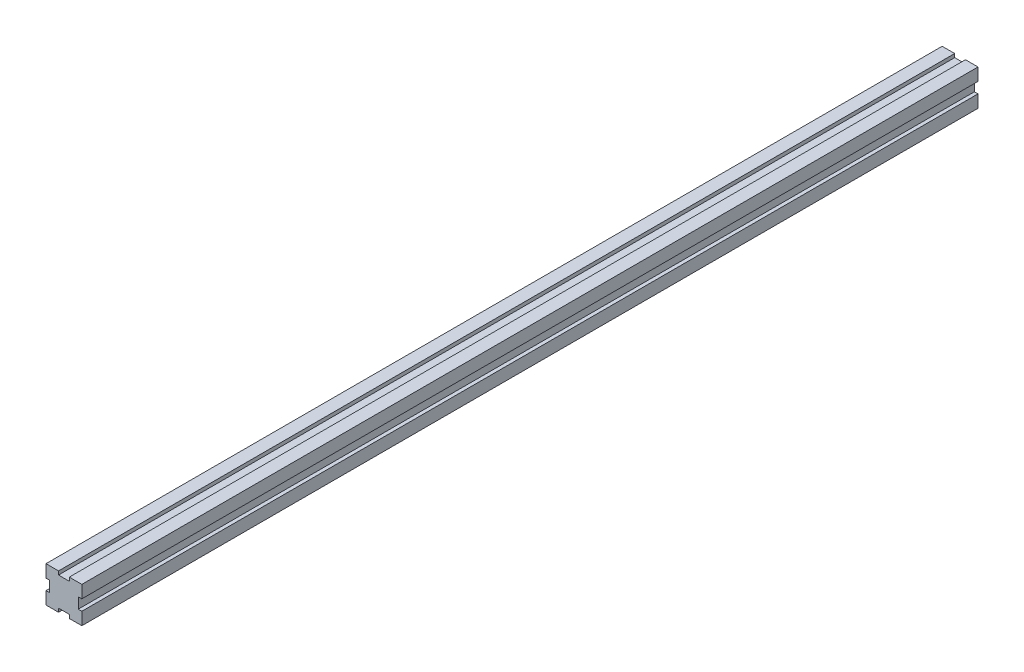
ISO-10303-21;
HEADER;
FILE_DESCRIPTION(('STEP AP214'),'2;1');
FILE_NAME('part.step','',(''),(''),'','','');
FILE_SCHEMA(('AUTOMOTIVE_DESIGN { 1 0 10303 214 1 1 1 1 }'));
ENDSEC;
DATA;
#1=APPLICATION_CONTEXT('core data for automotive mechanical design processes');
#2=APPLICATION_PROTOCOL_DEFINITION('international standard','automotive_design',2000,#1);
#3=PRODUCT_CONTEXT('',#1,'mechanical');
#4=PRODUCT('Part','Part','',(#3));
#5=PRODUCT_RELATED_PRODUCT_CATEGORY('part','',(#4));
#6=PRODUCT_DEFINITION_FORMATION('','',#4);
#7=PRODUCT_DEFINITION_CONTEXT('part definition',#1,'design');
#8=PRODUCT_DEFINITION('design','',#6,#7);
#9=PRODUCT_DEFINITION_SHAPE('','',#8);
#10=(LENGTH_UNIT() NAMED_UNIT(*) SI_UNIT(.MILLI.,.METRE.));
#11=(NAMED_UNIT(*) PLANE_ANGLE_UNIT() SI_UNIT($,.RADIAN.));
#12=(NAMED_UNIT(*) SI_UNIT($,.STERADIAN.) SOLID_ANGLE_UNIT());
#13=UNCERTAINTY_MEASURE_WITH_UNIT(LENGTH_MEASURE(1.E-05),#10,'distance_accuracy_value','');
#14=(GEOMETRIC_REPRESENTATION_CONTEXT(3) GLOBAL_UNCERTAINTY_ASSIGNED_CONTEXT((#13)) GLOBAL_UNIT_ASSIGNED_CONTEXT((#10,
#11,#12)) REPRESENTATION_CONTEXT('',''));
#15=CARTESIAN_POINT('',(0.,0.,0.));
#16=DIRECTION('',(0.,0.,1.));
#17=DIRECTION('',(1.,0.,0.));
#18=AXIS2_PLACEMENT_3D('',#15,#16,#17);
#19=CARTESIAN_POINT('',(0.,0.,500.));
#20=DIRECTION('',(1.,0.,0.));
#21=DIRECTION('',(0.,1.,0.));
#22=AXIS2_PLACEMENT_3D('',#19,#20,#21);
#23=PLANE('',#22);
#24=DIRECTION('',(0.,-1.,0.));
#25=VECTOR('',#24,1.);
#26=CARTESIAN_POINT('',(0.,0.,0.));
#27=LINE('',#26,#25);
#28=CARTESIAN_POINT('',(0.,0.,0.));
#29=VERTEX_POINT('',#28);
#30=CARTESIAN_POINT('',(0.,-7.,0.));
#31=VERTEX_POINT('',#30);
#32=EDGE_CURVE('E203',#29,#31,#27,.T.);
#33=ORIENTED_EDGE('',*,*,#32,.T.);
#34=DIRECTION('',(0.,0.,-1.));
#35=VECTOR('',#34,1.);
#36=CARTESIAN_POINT('',(0.,-7.,500.));
#37=LINE('',#36,#35);
#38=CARTESIAN_POINT('',(0.,-7.,500.));
#39=VERTEX_POINT('',#38);
#40=EDGE_CURVE('E11',#39,#31,#37,.T.);
#41=ORIENTED_EDGE('',*,*,#40,.F.);
#42=DIRECTION('',(0.,-1.,0.));
#43=VECTOR('',#42,1.);
#44=CARTESIAN_POINT('',(0.,0.,500.));
#45=LINE('',#44,#43);
#46=CARTESIAN_POINT('',(0.,0.,500.));
#47=VERTEX_POINT('',#46);
#48=EDGE_CURVE('E241',#47,#39,#45,.T.);
#49=ORIENTED_EDGE('',*,*,#48,.F.);
#50=DIRECTION('',(0.,0.,-1.));
#51=VECTOR('',#50,1.);
#52=CARTESIAN_POINT('',(0.,0.,500.));
#53=LINE('',#52,#51);
#54=EDGE_CURVE('E199',#47,#29,#53,.T.);
#55=ORIENTED_EDGE('',*,*,#54,.T.);
#56=EDGE_LOOP('',(#33,#41,#49,#55));
#57=FACE_BOUND('',#56,.T.);
#58=ADVANCED_FACE('F35',(#57),#23,.F.);
#59=CARTESIAN_POINT('',(0.,-7.,500.));
#60=DIRECTION('',(0.,1.,0.));
#61=DIRECTION('',(-1.,0.,0.));
#62=AXIS2_PLACEMENT_3D('',#59,#60,#61);
#63=PLANE('',#62);
#64=DIRECTION('',(1.,0.,0.));
#65=VECTOR('',#64,1.);
#66=CARTESIAN_POINT('',(0.,-7.,0.));
#67=LINE('',#66,#65);
#68=CARTESIAN_POINT('',(2.,-7.,0.));
#69=VERTEX_POINT('',#68);
#70=EDGE_CURVE('E206',#31,#69,#67,.T.);
#71=ORIENTED_EDGE('',*,*,#70,.T.);
#72=DIRECTION('',(0.,0.,-1.));
#73=VECTOR('',#72,1.);
#74=CARTESIAN_POINT('',(2.,-7.,500.));
#75=LINE('',#74,#73);
#76=CARTESIAN_POINT('',(2.,-7.,500.));
#77=VERTEX_POINT('',#76);
#78=EDGE_CURVE('E43',#77,#69,#75,.T.);
#79=ORIENTED_EDGE('',*,*,#78,.F.);
#80=DIRECTION('',(1.,0.,0.));
#81=VECTOR('',#80,1.);
#82=CARTESIAN_POINT('',(0.,-7.,500.));
#83=LINE('',#82,#81);
#84=EDGE_CURVE('E130',#39,#77,#83,.T.);
#85=ORIENTED_EDGE('',*,*,#84,.F.);
#86=ORIENTED_EDGE('',*,*,#40,.T.);
#87=EDGE_LOOP('',(#71,#79,#85,#86));
#88=FACE_BOUND('',#87,.T.);
#89=ADVANCED_FACE('F359',(#88),#63,.F.);
#90=CARTESIAN_POINT('',(2.,-7.,500.));
#91=DIRECTION('',(1.,0.,0.));
#92=DIRECTION('',(0.,0.,-1.));
#93=AXIS2_PLACEMENT_3D('',#90,#91,#92);
#94=PLANE('',#93);
#95=DIRECTION('',(0.,-1.,0.));
#96=VECTOR('',#95,1.);
#97=CARTESIAN_POINT('',(2.,-7.,0.));
#98=LINE('',#97,#96);
#99=CARTESIAN_POINT('',(2.,-13.,0.));
#100=VERTEX_POINT('',#99);
#101=EDGE_CURVE('E208',#69,#100,#98,.T.);
#102=ORIENTED_EDGE('',*,*,#101,.T.);
#103=DIRECTION('',(0.,0.,-1.));
#104=VECTOR('',#103,1.);
#105=CARTESIAN_POINT('',(2.,-13.,500.));
#106=LINE('',#105,#104);
#107=CARTESIAN_POINT('',(2.,-13.,500.));
#108=VERTEX_POINT('',#107);
#109=EDGE_CURVE('E284',#108,#100,#106,.T.);
#110=ORIENTED_EDGE('',*,*,#109,.F.);
#111=DIRECTION('',(0.,-1.,0.));
#112=VECTOR('',#111,1.);
#113=CARTESIAN_POINT('',(2.,-7.,500.));
#114=LINE('',#113,#112);
#115=EDGE_CURVE('E292',#77,#108,#114,.T.);
#116=ORIENTED_EDGE('',*,*,#115,.F.);
#117=ORIENTED_EDGE('',*,*,#78,.T.);
#118=EDGE_LOOP('',(#102,#110,#116,#117));
#119=FACE_BOUND('',#118,.T.);
#120=ADVANCED_FACE('F290',(#119),#94,.F.);
#121=CARTESIAN_POINT('',(0.,-13.,500.));
#122=DIRECTION('',(0.,-1.,0.));
#123=DIRECTION('',(1.,0.,0.));
#124=AXIS2_PLACEMENT_3D('',#121,#122,#123);
#125=PLANE('',#124);
#126=DIRECTION('',(-1.,0.,0.));
#127=VECTOR('',#126,1.);
#128=CARTESIAN_POINT('',(0.,-13.,0.));
#129=LINE('',#128,#127);
#130=CARTESIAN_POINT('',(0.,-13.,0.));
#131=VERTEX_POINT('',#130);
#132=EDGE_CURVE('E210',#100,#131,#129,.T.);
#133=ORIENTED_EDGE('',*,*,#132,.T.);
#134=DIRECTION('',(0.,0.,-1.));
#135=VECTOR('',#134,1.);
#136=CARTESIAN_POINT('',(0.,-13.,500.));
#137=LINE('',#136,#135);
#138=CARTESIAN_POINT('',(0.,-13.,500.));
#139=VERTEX_POINT('',#138);
#140=EDGE_CURVE('E281',#139,#131,#137,.T.);
#141=ORIENTED_EDGE('',*,*,#140,.F.);
#142=DIRECTION('',(-1.,0.,0.));
#143=VECTOR('',#142,1.);
#144=CARTESIAN_POINT('',(0.,-13.,500.));
#145=LINE('',#144,#143);
#146=EDGE_CURVE('E310',#108,#139,#145,.T.);
#147=ORIENTED_EDGE('',*,*,#146,.F.);
#148=ORIENTED_EDGE('',*,*,#109,.T.);
#149=EDGE_LOOP('',(#133,#141,#147,#148));
#150=FACE_BOUND('',#149,.T.);
#151=ADVANCED_FACE('F301',(#150),#125,.F.);
#152=CARTESIAN_POINT('',(0.,-13.,500.));
#153=DIRECTION('',(1.,0.,0.));
#154=DIRECTION('',(0.,1.,0.));
#155=AXIS2_PLACEMENT_3D('',#152,#153,#154);
#156=PLANE('',#155);
#157=DIRECTION('',(0.,-1.,0.));
#158=VECTOR('',#157,1.);
#159=CARTESIAN_POINT('',(0.,-13.,0.));
#160=LINE('',#159,#158);
#161=CARTESIAN_POINT('',(0.,-20.,0.));
#162=VERTEX_POINT('',#161);
#163=EDGE_CURVE('E212',#131,#162,#160,.T.);
#164=ORIENTED_EDGE('',*,*,#163,.T.);
#165=DIRECTION('',(0.,0.,-1.));
#166=VECTOR('',#165,1.);
#167=CARTESIAN_POINT('',(0.,-20.,500.));
#168=LINE('',#167,#166);
#169=CARTESIAN_POINT('',(0.,-20.,500.));
#170=VERTEX_POINT('',#169);
#171=EDGE_CURVE('E278',#170,#162,#168,.T.);
#172=ORIENTED_EDGE('',*,*,#171,.F.);
#173=DIRECTION('',(0.,-1.,0.));
#174=VECTOR('',#173,1.);
#175=CARTESIAN_POINT('',(0.,-13.,500.));
#176=LINE('',#175,#174);
#177=EDGE_CURVE('E307',#139,#170,#176,.T.);
#178=ORIENTED_EDGE('',*,*,#177,.F.);
#179=ORIENTED_EDGE('',*,*,#140,.T.);
#180=EDGE_LOOP('',(#164,#172,#178,#179));
#181=FACE_BOUND('',#180,.T.);
#182=ADVANCED_FACE('F305',(#181),#156,.F.);
#183=CARTESIAN_POINT('',(0.,-20.,500.));
#184=DIRECTION('',(0.,1.,0.));
#185=DIRECTION('',(0.,0.,1.));
#186=AXIS2_PLACEMENT_3D('',#183,#184,#185);
#187=PLANE('',#186);
#188=DIRECTION('',(1.,0.,0.));
#189=VECTOR('',#188,1.);
#190=CARTESIAN_POINT('',(0.,-20.,0.));
#191=LINE('',#190,#189);
#192=CARTESIAN_POINT('',(7.,-20.,0.));
#193=VERTEX_POINT('',#192);
#194=EDGE_CURVE('E214',#162,#193,#191,.T.);
#195=ORIENTED_EDGE('',*,*,#194,.T.);
#196=DIRECTION('',(0.,0.,-1.));
#197=VECTOR('',#196,1.);
#198=CARTESIAN_POINT('',(7.,-20.,500.));
#199=LINE('',#198,#197);
#200=CARTESIAN_POINT('',(7.,-20.,500.));
#201=VERTEX_POINT('',#200);
#202=EDGE_CURVE('E275',#201,#193,#199,.T.);
#203=ORIENTED_EDGE('',*,*,#202,.F.);
#204=DIRECTION('',(1.,0.,0.));
#205=VECTOR('',#204,1.);
#206=CARTESIAN_POINT('',(0.,-20.,500.));
#207=LINE('',#206,#205);
#208=EDGE_CURVE('E309',#170,#201,#207,.T.);
#209=ORIENTED_EDGE('',*,*,#208,.F.);
#210=ORIENTED_EDGE('',*,*,#171,.T.);
#211=EDGE_LOOP('',(#195,#203,#209,#210));
#212=FACE_BOUND('',#211,.T.);
#213=ADVANCED_FACE('F372',(#212),#187,.F.);
#214=CARTESIAN_POINT('',(7.,-20.,500.));
#215=DIRECTION('',(-1.,0.,0.));
#216=DIRECTION('',(0.,-1.,0.));
#217=AXIS2_PLACEMENT_3D('',#214,#215,#216);
#218=PLANE('',#217);
#219=DIRECTION('',(0.,1.,0.));
#220=VECTOR('',#219,1.);
#221=CARTESIAN_POINT('',(7.,-20.,0.));
#222=LINE('',#221,#220);
#223=CARTESIAN_POINT('',(7.,-18.,0.));
#224=VERTEX_POINT('',#223);
#225=EDGE_CURVE('E216',#193,#224,#222,.T.);
#226=ORIENTED_EDGE('',*,*,#225,.T.);
#227=DIRECTION('',(0.,0.,-1.));
#228=VECTOR('',#227,1.);
#229=CARTESIAN_POINT('',(7.,-18.,500.));
#230=LINE('',#229,#228);
#231=CARTESIAN_POINT('',(7.,-18.,500.));
#232=VERTEX_POINT('',#231);
#233=EDGE_CURVE('E272',#232,#224,#230,.T.);
#234=ORIENTED_EDGE('',*,*,#233,.F.);
#235=DIRECTION('',(0.,1.,0.));
#236=VECTOR('',#235,1.);
#237=CARTESIAN_POINT('',(7.,-20.,500.));
#238=LINE('',#237,#236);
#239=EDGE_CURVE('E312',#201,#232,#238,.T.);
#240=ORIENTED_EDGE('',*,*,#239,.F.);
#241=ORIENTED_EDGE('',*,*,#202,.T.);
#242=EDGE_LOOP('',(#226,#234,#240,#241));
#243=FACE_BOUND('',#242,.T.);
#244=ADVANCED_FACE('F375',(#243),#218,.F.);
#245=CARTESIAN_POINT('',(7.,-18.,500.));
#246=DIRECTION('',(0.,1.,0.));
#247=DIRECTION('',(0.,0.,1.));
#248=AXIS2_PLACEMENT_3D('',#245,#246,#247);
#249=PLANE('',#248);
#250=DIRECTION('',(1.,0.,0.));
#251=VECTOR('',#250,1.);
#252=CARTESIAN_POINT('',(7.,-18.,0.));
#253=LINE('',#252,#251);
#254=CARTESIAN_POINT('',(13.,-18.,0.));
#255=VERTEX_POINT('',#254);
#256=EDGE_CURVE('E218',#224,#255,#253,.T.);
#257=ORIENTED_EDGE('',*,*,#256,.T.);
#258=DIRECTION('',(0.,0.,-1.));
#259=VECTOR('',#258,1.);
#260=CARTESIAN_POINT('',(13.,-18.,500.));
#261=LINE('',#260,#259);
#262=CARTESIAN_POINT('',(13.,-18.,500.));
#263=VERTEX_POINT('',#262);
#264=EDGE_CURVE('E269',#263,#255,#261,.T.);
#265=ORIENTED_EDGE('',*,*,#264,.F.);
#266=DIRECTION('',(1.,0.,0.));
#267=VECTOR('',#266,1.);
#268=CARTESIAN_POINT('',(7.,-18.,500.));
#269=LINE('',#268,#267);
#270=EDGE_CURVE('E318',#232,#263,#269,.T.);
#271=ORIENTED_EDGE('',*,*,#270,.F.);
#272=ORIENTED_EDGE('',*,*,#233,.T.);
#273=EDGE_LOOP('',(#257,#265,#271,#272));
#274=FACE_BOUND('',#273,.T.);
#275=ADVANCED_FACE('F379',(#274),#249,.F.);
#276=CARTESIAN_POINT('',(13.,-20.,500.));
#277=DIRECTION('',(1.,0.,0.));
#278=DIRECTION('',(0.,1.,0.));
#279=AXIS2_PLACEMENT_3D('',#276,#277,#278);
#280=PLANE('',#279);
#281=DIRECTION('',(0.,-1.,0.));
#282=VECTOR('',#281,1.);
#283=CARTESIAN_POINT('',(13.,-20.,0.));
#284=LINE('',#283,#282);
#285=CARTESIAN_POINT('',(13.,-20.,0.));
#286=VERTEX_POINT('',#285);
#287=EDGE_CURVE('E220',#255,#286,#284,.T.);
#288=ORIENTED_EDGE('',*,*,#287,.T.);
#289=DIRECTION('',(0.,0.,-1.));
#290=VECTOR('',#289,1.);
#291=CARTESIAN_POINT('',(13.,-20.,500.));
#292=LINE('',#291,#290);
#293=CARTESIAN_POINT('',(13.,-20.,500.));
#294=VERTEX_POINT('',#293);
#295=EDGE_CURVE('E266',#294,#286,#292,.T.);
#296=ORIENTED_EDGE('',*,*,#295,.F.);
#297=DIRECTION('',(0.,-1.,0.));
#298=VECTOR('',#297,1.);
#299=CARTESIAN_POINT('',(13.,-20.,500.));
#300=LINE('',#299,#298);
#301=EDGE_CURVE('E320',#263,#294,#300,.T.);
#302=ORIENTED_EDGE('',*,*,#301,.F.);
#303=ORIENTED_EDGE('',*,*,#264,.T.);
#304=EDGE_LOOP('',(#288,#296,#302,#303));
#305=FACE_BOUND('',#304,.T.);
#306=ADVANCED_FACE('F383',(#305),#280,.F.);
#307=CARTESIAN_POINT('',(13.,-20.,500.));
#308=DIRECTION('',(0.,1.,0.));
#309=DIRECTION('',(0.,0.,1.));
#310=AXIS2_PLACEMENT_3D('',#307,#308,#309);
#311=PLANE('',#310);
#312=DIRECTION('',(1.,0.,0.));
#313=VECTOR('',#312,1.);
#314=CARTESIAN_POINT('',(13.,-20.,0.));
#315=LINE('',#314,#313);
#316=CARTESIAN_POINT('',(20.,-20.,0.));
#317=VERTEX_POINT('',#316);
#318=EDGE_CURVE('E222',#286,#317,#315,.T.);
#319=ORIENTED_EDGE('',*,*,#318,.T.);
#320=DIRECTION('',(0.,0.,-1.));
#321=VECTOR('',#320,1.);
#322=CARTESIAN_POINT('',(20.,-20.,500.));
#323=LINE('',#322,#321);
#324=CARTESIAN_POINT('',(20.,-20.,500.));
#325=VERTEX_POINT('',#324);
#326=EDGE_CURVE('E263',#325,#317,#323,.T.);
#327=ORIENTED_EDGE('',*,*,#326,.F.);
#328=DIRECTION('',(1.,0.,0.));
#329=VECTOR('',#328,1.);
#330=CARTESIAN_POINT('',(13.,-20.,500.));
#331=LINE('',#330,#329);
#332=EDGE_CURVE('E322',#294,#325,#331,.T.);
#333=ORIENTED_EDGE('',*,*,#332,.F.);
#334=ORIENTED_EDGE('',*,*,#295,.T.);
#335=EDGE_LOOP('',(#319,#327,#333,#334));
#336=FACE_BOUND('',#335,.T.);
#337=ADVANCED_FACE('F387',(#336),#311,.F.);
#338=CARTESIAN_POINT('',(20.,-13.,500.));
#339=DIRECTION('',(-1.,0.,0.));
#340=DIRECTION('',(0.,0.,1.));
#341=AXIS2_PLACEMENT_3D('',#338,#339,#340);
#342=PLANE('',#341);
#343=DIRECTION('',(0.,1.,0.));
#344=VECTOR('',#343,1.);
#345=CARTESIAN_POINT('',(20.,-13.,0.));
#346=LINE('',#345,#344);
#347=CARTESIAN_POINT('',(20.,-13.,0.));
#348=VERTEX_POINT('',#347);
#349=EDGE_CURVE('E224',#317,#348,#346,.T.);
#350=ORIENTED_EDGE('',*,*,#349,.T.);
#351=DIRECTION('',(0.,0.,-1.));
#352=VECTOR('',#351,1.);
#353=CARTESIAN_POINT('',(20.,-13.,500.));
#354=LINE('',#353,#352);
#355=CARTESIAN_POINT('',(20.,-13.,500.));
#356=VERTEX_POINT('',#355);
#357=EDGE_CURVE('E260',#356,#348,#354,.T.);
#358=ORIENTED_EDGE('',*,*,#357,.F.);
#359=DIRECTION('',(0.,1.,0.));
#360=VECTOR('',#359,1.);
#361=CARTESIAN_POINT('',(20.,-13.,500.));
#362=LINE('',#361,#360);
#363=EDGE_CURVE('E324',#325,#356,#362,.T.);
#364=ORIENTED_EDGE('',*,*,#363,.F.);
#365=ORIENTED_EDGE('',*,*,#326,.T.);
#366=EDGE_LOOP('',(#350,#358,#364,#365));
#367=FACE_BOUND('',#366,.T.);
#368=ADVANCED_FACE('F391',(#367),#342,.F.);
#369=CARTESIAN_POINT('',(20.,-13.,500.));
#370=DIRECTION('',(0.,-1.,0.));
#371=DIRECTION('',(1.,0.,0.));
#372=AXIS2_PLACEMENT_3D('',#369,#370,#371);
#373=PLANE('',#372);
#374=DIRECTION('',(-1.,0.,0.));
#375=VECTOR('',#374,1.);
#376=CARTESIAN_POINT('',(20.,-13.,0.));
#377=LINE('',#376,#375);
#378=CARTESIAN_POINT('',(18.,-13.,0.));
#379=VERTEX_POINT('',#378);
#380=EDGE_CURVE('E226',#348,#379,#377,.T.);
#381=ORIENTED_EDGE('',*,*,#380,.T.);
#382=DIRECTION('',(0.,0.,-1.));
#383=VECTOR('',#382,1.);
#384=CARTESIAN_POINT('',(18.,-13.,500.));
#385=LINE('',#384,#383);
#386=CARTESIAN_POINT('',(18.,-13.,500.));
#387=VERTEX_POINT('',#386);
#388=EDGE_CURVE('E257',#387,#379,#385,.T.);
#389=ORIENTED_EDGE('',*,*,#388,.F.);
#390=DIRECTION('',(-1.,0.,0.));
#391=VECTOR('',#390,1.);
#392=CARTESIAN_POINT('',(20.,-13.,500.));
#393=LINE('',#392,#391);
#394=EDGE_CURVE('E326',#356,#387,#393,.T.);
#395=ORIENTED_EDGE('',*,*,#394,.F.);
#396=ORIENTED_EDGE('',*,*,#357,.T.);
#397=EDGE_LOOP('',(#381,#389,#395,#396));
#398=FACE_BOUND('',#397,.T.);
#399=ADVANCED_FACE('F395',(#398),#373,.F.);
#400=CARTESIAN_POINT('',(18.,-7.,500.));
#401=DIRECTION('',(-1.,0.,0.));
#402=DIRECTION('',(0.,0.,1.));
#403=AXIS2_PLACEMENT_3D('',#400,#401,#402);
#404=PLANE('',#403);
#405=DIRECTION('',(0.,1.,0.));
#406=VECTOR('',#405,1.);
#407=CARTESIAN_POINT('',(18.,-7.,0.));
#408=LINE('',#407,#406);
#409=CARTESIAN_POINT('',(18.,-7.,0.));
#410=VERTEX_POINT('',#409);
#411=EDGE_CURVE('E228',#379,#410,#408,.T.);
#412=ORIENTED_EDGE('',*,*,#411,.T.);
#413=DIRECTION('',(0.,0.,-1.));
#414=VECTOR('',#413,1.);
#415=CARTESIAN_POINT('',(18.,-7.,500.));
#416=LINE('',#415,#414);
#417=CARTESIAN_POINT('',(18.,-7.,500.));
#418=VERTEX_POINT('',#417);
#419=EDGE_CURVE('E254',#418,#410,#416,.T.);
#420=ORIENTED_EDGE('',*,*,#419,.F.);
#421=DIRECTION('',(0.,1.,0.));
#422=VECTOR('',#421,1.);
#423=CARTESIAN_POINT('',(18.,-7.,500.));
#424=LINE('',#423,#422);
#425=EDGE_CURVE('E328',#387,#418,#424,.T.);
#426=ORIENTED_EDGE('',*,*,#425,.F.);
#427=ORIENTED_EDGE('',*,*,#388,.T.);
#428=EDGE_LOOP('',(#412,#420,#426,#427));
#429=FACE_BOUND('',#428,.T.);
#430=ADVANCED_FACE('F399',(#429),#404,.F.);
#431=CARTESIAN_POINT('',(20.,-7.,500.));
#432=DIRECTION('',(0.,1.,0.));
#433=DIRECTION('',(-1.,0.,0.));
#434=AXIS2_PLACEMENT_3D('',#431,#432,#433);
#435=PLANE('',#434);
#436=DIRECTION('',(1.,0.,0.));
#437=VECTOR('',#436,1.);
#438=CARTESIAN_POINT('',(20.,-7.,0.));
#439=LINE('',#438,#437);
#440=CARTESIAN_POINT('',(20.,-7.,0.));
#441=VERTEX_POINT('',#440);
#442=EDGE_CURVE('E230',#410,#441,#439,.T.);
#443=ORIENTED_EDGE('',*,*,#442,.T.);
#444=DIRECTION('',(0.,0.,-1.));
#445=VECTOR('',#444,1.);
#446=CARTESIAN_POINT('',(20.,-7.,500.));
#447=LINE('',#446,#445);
#448=CARTESIAN_POINT('',(20.,-7.,500.));
#449=VERTEX_POINT('',#448);
#450=EDGE_CURVE('E251',#449,#441,#447,.T.);
#451=ORIENTED_EDGE('',*,*,#450,.F.);
#452=DIRECTION('',(1.,0.,0.));
#453=VECTOR('',#452,1.);
#454=CARTESIAN_POINT('',(20.,-7.,500.));
#455=LINE('',#454,#453);
#456=EDGE_CURVE('E330',#418,#449,#455,.T.);
#457=ORIENTED_EDGE('',*,*,#456,.F.);
#458=ORIENTED_EDGE('',*,*,#419,.T.);
#459=EDGE_LOOP('',(#443,#451,#457,#458));
#460=FACE_BOUND('',#459,.T.);
#461=ADVANCED_FACE('F403',(#460),#435,.F.);
#462=CARTESIAN_POINT('',(20.,0.,500.));
#463=DIRECTION('',(-1.,0.,0.));
#464=DIRECTION('',(0.,-1.,0.));
#465=AXIS2_PLACEMENT_3D('',#462,#463,#464);
#466=PLANE('',#465);
#467=DIRECTION('',(0.,1.,0.));
#468=VECTOR('',#467,1.);
#469=CARTESIAN_POINT('',(20.,0.,0.));
#470=LINE('',#469,#468);
#471=CARTESIAN_POINT('',(20.,0.,0.));
#472=VERTEX_POINT('',#471);
#473=EDGE_CURVE('E232',#441,#472,#470,.T.);
#474=ORIENTED_EDGE('',*,*,#473,.T.);
#475=DIRECTION('',(0.,0.,-1.));
#476=VECTOR('',#475,1.);
#477=CARTESIAN_POINT('',(20.,0.,500.));
#478=LINE('',#477,#476);
#479=CARTESIAN_POINT('',(20.,0.,500.));
#480=VERTEX_POINT('',#479);
#481=EDGE_CURVE('E248',#480,#472,#478,.T.);
#482=ORIENTED_EDGE('',*,*,#481,.F.);
#483=DIRECTION('',(0.,1.,0.));
#484=VECTOR('',#483,1.);
#485=CARTESIAN_POINT('',(20.,0.,500.));
#486=LINE('',#485,#484);
#487=EDGE_CURVE('E332',#449,#480,#486,.T.);
#488=ORIENTED_EDGE('',*,*,#487,.F.);
#489=ORIENTED_EDGE('',*,*,#450,.T.);
#490=EDGE_LOOP('',(#474,#482,#488,#489));
#491=FACE_BOUND('',#490,.T.);
#492=ADVANCED_FACE('F407',(#491),#466,.F.);
#493=CARTESIAN_POINT('',(13.,0.,500.));
#494=DIRECTION('',(0.,-1.,0.));
#495=DIRECTION('',(0.,0.,-1.));
#496=AXIS2_PLACEMENT_3D('',#493,#494,#495);
#497=PLANE('',#496);
#498=DIRECTION('',(-1.,0.,0.));
#499=VECTOR('',#498,1.);
#500=CARTESIAN_POINT('',(13.,0.,0.));
#501=LINE('',#500,#499);
#502=CARTESIAN_POINT('',(13.,0.,0.));
#503=VERTEX_POINT('',#502);
#504=EDGE_CURVE('E234',#472,#503,#501,.T.);
#505=ORIENTED_EDGE('',*,*,#504,.T.);
#506=DIRECTION('',(0.,0.,-1.));
#507=VECTOR('',#506,1.);
#508=CARTESIAN_POINT('',(13.,0.,500.));
#509=LINE('',#508,#507);
#510=CARTESIAN_POINT('',(13.,0.,500.));
#511=VERTEX_POINT('',#510);
#512=EDGE_CURVE('E245',#511,#503,#509,.T.);
#513=ORIENTED_EDGE('',*,*,#512,.F.);
#514=DIRECTION('',(-1.,0.,0.));
#515=VECTOR('',#514,1.);
#516=CARTESIAN_POINT('',(13.,0.,500.));
#517=LINE('',#516,#515);
#518=EDGE_CURVE('E334',#480,#511,#517,.T.);
#519=ORIENTED_EDGE('',*,*,#518,.F.);
#520=ORIENTED_EDGE('',*,*,#481,.T.);
#521=EDGE_LOOP('',(#505,#513,#519,#520));
#522=FACE_BOUND('',#521,.T.);
#523=ADVANCED_FACE('F340',(#522),#497,.F.);
#524=CARTESIAN_POINT('',(13.,0.,500.));
#525=DIRECTION('',(1.,0.,0.));
#526=DIRECTION('',(0.,1.,0.));
#527=AXIS2_PLACEMENT_3D('',#524,#525,#526);
#528=PLANE('',#527);
#529=DIRECTION('',(0.,-1.,0.));
#530=VECTOR('',#529,1.);
#531=CARTESIAN_POINT('',(13.,0.,0.));
#532=LINE('',#531,#530);
#533=CARTESIAN_POINT('',(13.,-2.,0.));
#534=VERTEX_POINT('',#533);
#535=EDGE_CURVE('E236',#503,#534,#532,.T.);
#536=ORIENTED_EDGE('',*,*,#535,.T.);
#537=DIRECTION('',(0.,0.,-1.));
#538=VECTOR('',#537,1.);
#539=CARTESIAN_POINT('',(13.,-2.,500.));
#540=LINE('',#539,#538);
#541=CARTESIAN_POINT('',(13.,-2.,500.));
#542=VERTEX_POINT('',#541);
#543=EDGE_CURVE('E194',#542,#534,#540,.T.);
#544=ORIENTED_EDGE('',*,*,#543,.F.);
#545=DIRECTION('',(0.,-1.,0.));
#546=VECTOR('',#545,1.);
#547=CARTESIAN_POINT('',(13.,0.,500.));
#548=LINE('',#547,#546);
#549=EDGE_CURVE('E185',#511,#542,#548,.T.);
#550=ORIENTED_EDGE('',*,*,#549,.F.);
#551=ORIENTED_EDGE('',*,*,#512,.T.);
#552=EDGE_LOOP('',(#536,#544,#550,#551));
#553=FACE_BOUND('',#552,.T.);
#554=ADVANCED_FACE('F344',(#553),#528,.F.);
#555=CARTESIAN_POINT('',(7.,-2.,500.));
#556=DIRECTION('',(0.,-1.,0.));
#557=DIRECTION('',(0.,0.,-1.));
#558=AXIS2_PLACEMENT_3D('',#555,#556,#557);
#559=PLANE('',#558);
#560=DIRECTION('',(-1.,0.,0.));
#561=VECTOR('',#560,1.);
#562=CARTESIAN_POINT('',(7.,-2.,0.));
#563=LINE('',#562,#561);
#564=CARTESIAN_POINT('',(7.,-2.,0.));
#565=VERTEX_POINT('',#564);
#566=EDGE_CURVE('E193',#534,#565,#563,.T.);
#567=ORIENTED_EDGE('',*,*,#566,.T.);
#568=DIRECTION('',(0.,0.,-1.));
#569=VECTOR('',#568,1.);
#570=CARTESIAN_POINT('',(7.,-2.,500.));
#571=LINE('',#570,#569);
#572=CARTESIAN_POINT('',(7.,-2.,500.));
#573=VERTEX_POINT('',#572);
#574=EDGE_CURVE('E190',#573,#565,#571,.T.);
#575=ORIENTED_EDGE('',*,*,#574,.F.);
#576=DIRECTION('',(-1.,0.,0.));
#577=VECTOR('',#576,1.);
#578=CARTESIAN_POINT('',(7.,-2.,500.));
#579=LINE('',#578,#577);
#580=EDGE_CURVE('E179',#542,#573,#579,.T.);
#581=ORIENTED_EDGE('',*,*,#580,.F.);
#582=ORIENTED_EDGE('',*,*,#543,.T.);
#583=EDGE_LOOP('',(#567,#575,#581,#582));
#584=FACE_BOUND('',#583,.T.);
#585=ADVANCED_FACE('F191',(#584),#559,.F.);
#586=CARTESIAN_POINT('',(7.,0.,500.));
#587=DIRECTION('',(-1.,0.,0.));
#588=DIRECTION('',(0.,-1.,0.));
#589=AXIS2_PLACEMENT_3D('',#586,#587,#588);
#590=PLANE('',#589);
#591=DIRECTION('',(0.,1.,0.));
#592=VECTOR('',#591,1.);
#593=CARTESIAN_POINT('',(7.,0.,0.));
#594=LINE('',#593,#592);
#595=CARTESIAN_POINT('',(7.,0.,0.));
#596=VERTEX_POINT('',#595);
#597=EDGE_CURVE('E116',#565,#596,#594,.T.);
#598=ORIENTED_EDGE('',*,*,#597,.T.);
#599=DIRECTION('',(0.,0.,-1.));
#600=VECTOR('',#599,1.);
#601=CARTESIAN_POINT('',(7.,0.,500.));
#602=LINE('',#601,#600);
#603=CARTESIAN_POINT('',(7.,0.,500.));
#604=VERTEX_POINT('',#603);
#605=EDGE_CURVE('E195',#604,#596,#602,.T.);
#606=ORIENTED_EDGE('',*,*,#605,.F.);
#607=DIRECTION('',(0.,1.,0.));
#608=VECTOR('',#607,1.);
#609=CARTESIAN_POINT('',(7.,0.,500.));
#610=LINE('',#609,#608);
#611=EDGE_CURVE('E183',#573,#604,#610,.T.);
#612=ORIENTED_EDGE('',*,*,#611,.F.);
#613=ORIENTED_EDGE('',*,*,#574,.T.);
#614=EDGE_LOOP('',(#598,#606,#612,#613));
#615=FACE_BOUND('',#614,.T.);
#616=ADVANCED_FACE('F197',(#615),#590,.F.);
#617=CARTESIAN_POINT('',(0.,0.,500.));
#618=DIRECTION('',(0.,-1.,0.));
#619=DIRECTION('',(0.,0.,-1.));
#620=AXIS2_PLACEMENT_3D('',#617,#618,#619);
#621=PLANE('',#620);
#622=DIRECTION('',(-1.,0.,0.));
#623=VECTOR('',#622,1.);
#624=CARTESIAN_POINT('',(0.,0.,0.));
#625=LINE('',#624,#623);
#626=EDGE_CURVE('E122',#596,#29,#625,.T.);
#627=ORIENTED_EDGE('',*,*,#626,.T.);
#628=ORIENTED_EDGE('',*,*,#54,.F.);
#629=DIRECTION('',(-1.,0.,0.));
#630=VECTOR('',#629,1.);
#631=CARTESIAN_POINT('',(0.,0.,500.));
#632=LINE('',#631,#630);
#633=EDGE_CURVE('E51',#604,#47,#632,.T.);
#634=ORIENTED_EDGE('',*,*,#633,.F.);
#635=ORIENTED_EDGE('',*,*,#605,.T.);
#636=EDGE_LOOP('',(#627,#628,#634,#635));
#637=FACE_BOUND('',#636,.T.);
#638=ADVANCED_FACE('F348',(#637),#621,.F.);
#639=CARTESIAN_POINT('',(0.,0.,500.));
#640=DIRECTION('',(0.,0.,1.));
#641=DIRECTION('',(1.,0.,0.));
#642=AXIS2_PLACEMENT_3D('',#639,#640,#641);
#643=PLANE('',#642);
#644=ORIENTED_EDGE('',*,*,#48,.T.);
#645=ORIENTED_EDGE('',*,*,#84,.T.);
#646=ORIENTED_EDGE('',*,*,#115,.T.);
#647=ORIENTED_EDGE('',*,*,#146,.T.);
#648=ORIENTED_EDGE('',*,*,#177,.T.);
#649=ORIENTED_EDGE('',*,*,#208,.T.);
#650=ORIENTED_EDGE('',*,*,#239,.T.);
#651=ORIENTED_EDGE('',*,*,#270,.T.);
#652=ORIENTED_EDGE('',*,*,#301,.T.);
#653=ORIENTED_EDGE('',*,*,#332,.T.);
#654=ORIENTED_EDGE('',*,*,#363,.T.);
#655=ORIENTED_EDGE('',*,*,#394,.T.);
#656=ORIENTED_EDGE('',*,*,#425,.T.);
#657=ORIENTED_EDGE('',*,*,#456,.T.);
#658=ORIENTED_EDGE('',*,*,#487,.T.);
#659=ORIENTED_EDGE('',*,*,#518,.T.);
#660=ORIENTED_EDGE('',*,*,#549,.T.);
#661=ORIENTED_EDGE('',*,*,#580,.T.);
#662=ORIENTED_EDGE('',*,*,#611,.T.);
#663=ORIENTED_EDGE('',*,*,#633,.T.);
#664=EDGE_LOOP('',(#644,#645,#646,#647,#648,#649,#650,#651,#652,#653,#654,#655,#656,#657,#658,
#659,#660,#661,#662,#663));
#665=FACE_BOUND('',#664,.T.);
#666=ADVANCED_FACE('F181',(#665),#643,.T.);
#667=CARTESIAN_POINT('',(0.,0.,0.));
#668=DIRECTION('',(0.,0.,1.));
#669=DIRECTION('',(1.,0.,0.));
#670=AXIS2_PLACEMENT_3D('',#667,#668,#669);
#671=PLANE('',#670);
#672=ORIENTED_EDGE('',*,*,#32,.F.);
#673=ORIENTED_EDGE('',*,*,#626,.F.);
#674=ORIENTED_EDGE('',*,*,#597,.F.);
#675=ORIENTED_EDGE('',*,*,#566,.F.);
#676=ORIENTED_EDGE('',*,*,#535,.F.);
#677=ORIENTED_EDGE('',*,*,#504,.F.);
#678=ORIENTED_EDGE('',*,*,#473,.F.);
#679=ORIENTED_EDGE('',*,*,#442,.F.);
#680=ORIENTED_EDGE('',*,*,#411,.F.);
#681=ORIENTED_EDGE('',*,*,#380,.F.);
#682=ORIENTED_EDGE('',*,*,#349,.F.);
#683=ORIENTED_EDGE('',*,*,#318,.F.);
#684=ORIENTED_EDGE('',*,*,#287,.F.);
#685=ORIENTED_EDGE('',*,*,#256,.F.);
#686=ORIENTED_EDGE('',*,*,#225,.F.);
#687=ORIENTED_EDGE('',*,*,#194,.F.);
#688=ORIENTED_EDGE('',*,*,#163,.F.);
#689=ORIENTED_EDGE('',*,*,#132,.F.);
#690=ORIENTED_EDGE('',*,*,#101,.F.);
#691=ORIENTED_EDGE('',*,*,#70,.F.);
#692=EDGE_LOOP('',(#672,#673,#674,#675,#676,#677,#678,#679,#680,#681,#682,#683,#684,#685,#686,
#687,#688,#689,#690,#691));
#693=FACE_BOUND('',#692,.T.);
#694=ADVANCED_FACE('F296',(#693),#671,.F.);
#695=CLOSED_SHELL('',(#58,#89,#120,#151,#182,#213,#244,#275,#306,#337,#368,#399,#430,#461,#492,
#523,#554,#585,#616,#638,#666,#694));
#696=MANIFOLD_SOLID_BREP('B2',#695);
#697=ADVANCED_BREP_SHAPE_REPRESENTATION('',(#18,#696),#14);
#698=SHAPE_DEFINITION_REPRESENTATION(#9,#697);
ENDSEC;
END-ISO-10303-21;
